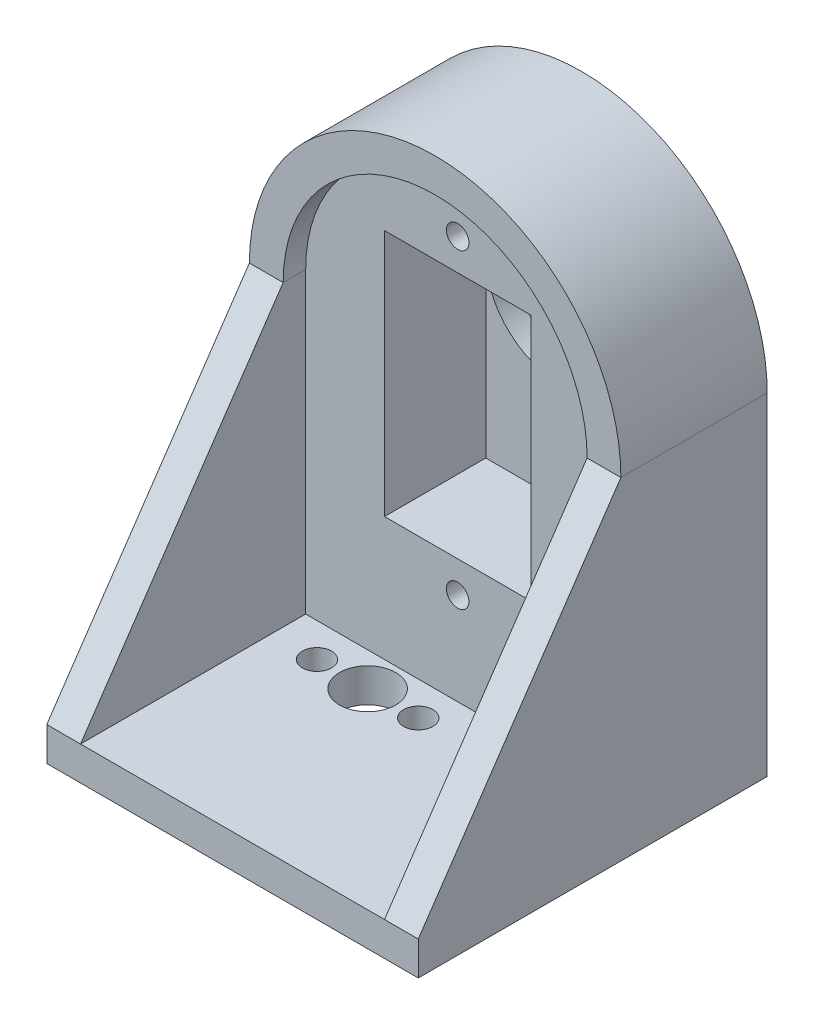
ISO-10303-21;
HEADER;
FILE_DESCRIPTION(('STEP AP214'),'2;1');
FILE_NAME('part.step','',(''),(''),'','','');
FILE_SCHEMA(('AUTOMOTIVE_DESIGN { 1 0 10303 214 1 1 1 1 }'));
ENDSEC;
DATA;
#1=APPLICATION_CONTEXT('core data for automotive mechanical design processes');
#2=APPLICATION_PROTOCOL_DEFINITION('international standard','automotive_design',2000,#1);
#3=PRODUCT_CONTEXT('',#1,'mechanical');
#4=PRODUCT('Part','Part','',(#3));
#5=PRODUCT_RELATED_PRODUCT_CATEGORY('part','',(#4));
#6=PRODUCT_DEFINITION_FORMATION('','',#4);
#7=PRODUCT_DEFINITION_CONTEXT('part definition',#1,'design');
#8=PRODUCT_DEFINITION('design','',#6,#7);
#9=PRODUCT_DEFINITION_SHAPE('','',#8);
#10=(LENGTH_UNIT() NAMED_UNIT(*) SI_UNIT(.MILLI.,.METRE.));
#11=(NAMED_UNIT(*) PLANE_ANGLE_UNIT() SI_UNIT($,.RADIAN.));
#12=(NAMED_UNIT(*) SI_UNIT($,.STERADIAN.) SOLID_ANGLE_UNIT());
#13=UNCERTAINTY_MEASURE_WITH_UNIT(LENGTH_MEASURE(1.E-05),#10,'distance_accuracy_value','');
#14=(GEOMETRIC_REPRESENTATION_CONTEXT(3) GLOBAL_UNCERTAINTY_ASSIGNED_CONTEXT((#13)) GLOBAL_UNIT_ASSIGNED_CONTEXT((#10,
#11,#12)) REPRESENTATION_CONTEXT('',''));
#15=CARTESIAN_POINT('',(0.,0.,0.));
#16=DIRECTION('',(0.,0.,1.));
#17=DIRECTION('',(1.,0.,0.));
#18=AXIS2_PLACEMENT_3D('',#15,#16,#17);
#19=CARTESIAN_POINT('',(0.,0.,13.));
#20=DIRECTION('',(0.,0.,1.));
#21=DIRECTION('',(1.,0.,0.));
#22=AXIS2_PLACEMENT_3D('',#19,#20,#21);
#23=PLANE('',#22);
#24=CARTESIAN_POINT('',(0.,0.,13.));
#25=DIRECTION('',(0.,0.,1.));
#26=DIRECTION('',(1.,0.,0.));
#27=AXIS2_PLACEMENT_3D('',#24,#25,#26);
#28=CIRCLE('',#27,13.5);
#29=CARTESIAN_POINT('',(13.5,0.,13.));
#30=VERTEX_POINT('',#29);
#31=CARTESIAN_POINT('',(-13.5,0.,13.));
#32=VERTEX_POINT('',#31);
#33=EDGE_CURVE('E167',#30,#32,#28,.T.);
#34=ORIENTED_EDGE('',*,*,#33,.F.);
#35=DIRECTION('',(-1.,0.,0.));
#36=VECTOR('',#35,1.);
#37=CARTESIAN_POINT('',(16.5,0.,13.));
#38=LINE('',#37,#36);
#39=CARTESIAN_POINT('',(16.5,0.,13.));
#40=VERTEX_POINT('',#39);
#41=EDGE_CURVE('E149',#40,#30,#38,.T.);
#42=ORIENTED_EDGE('',*,*,#41,.F.);
#43=CARTESIAN_POINT('',(0.,0.,13.));
#44=DIRECTION('',(0.,0.,1.));
#45=DIRECTION('',(1.,0.,0.));
#46=AXIS2_PLACEMENT_3D('',#43,#44,#45);
#47=CIRCLE('',#46,16.5);
#48=CARTESIAN_POINT('',(-16.5,0.,13.));
#49=VERTEX_POINT('',#48);
#50=EDGE_CURVE('E164',#40,#49,#47,.T.);
#51=ORIENTED_EDGE('',*,*,#50,.T.);
#52=DIRECTION('',(-1.,0.,0.));
#53=VECTOR('',#52,1.);
#54=CARTESIAN_POINT('',(-13.5,0.,13.));
#55=LINE('',#54,#53);
#56=EDGE_CURVE('E291',#32,#49,#55,.T.);
#57=ORIENTED_EDGE('',*,*,#56,.F.);
#58=EDGE_LOOP('',(#34,#42,#51,#57));
#59=FACE_BOUND('',#58,.T.);
#60=ADVANCED_FACE('F40',(#59),#23,.T.);
#61=CARTESIAN_POINT('',(-13.5,-26.5,11.));
#62=DIRECTION('',(0.,-1.,0.));
#63=DIRECTION('',(0.,0.,-1.));
#64=AXIS2_PLACEMENT_3D('',#61,#62,#63);
#65=PLANE('',#64);
#66=CARTESIAN_POINT('',(-9.50000000000001,-26.5,14.));
#67=DIRECTION('',(0.,-1.,0.));
#68=DIRECTION('',(0.,0.,-1.));
#69=AXIS2_PLACEMENT_3D('',#66,#67,#68);
#70=CIRCLE('',#69,1.3);
#71=CARTESIAN_POINT('',(-9.50000000000001,-26.5,12.7));
#72=VERTEX_POINT('',#71);
#73=EDGE_CURVE('E280',#72,#72,#70,.T.);
#74=ORIENTED_EDGE('',*,*,#73,.T.);
#75=EDGE_LOOP('',(#74));
#76=FACE_BOUND('',#75,.T.);
#77=CARTESIAN_POINT('',(-0.500000000000004,-26.5,14.));
#78=DIRECTION('',(0.,-1.,0.));
#79=DIRECTION('',(0.,0.,-1.));
#80=AXIS2_PLACEMENT_3D('',#77,#78,#79);
#81=CIRCLE('',#80,1.3);
#82=CARTESIAN_POINT('',(-0.500000000000004,-26.5,12.7));
#83=VERTEX_POINT('',#82);
#84=EDGE_CURVE('E283',#83,#83,#81,.T.);
#85=ORIENTED_EDGE('',*,*,#84,.T.);
#86=EDGE_LOOP('',(#85));
#87=FACE_BOUND('',#86,.T.);
#88=CARTESIAN_POINT('',(-5.,-26.5,14.));
#89=DIRECTION('',(0.,-1.,0.));
#90=DIRECTION('',(0.,0.,-1.));
#91=AXIS2_PLACEMENT_3D('',#88,#89,#90);
#92=CIRCLE('',#91,2.5);
#93=CARTESIAN_POINT('',(-5.,-26.5,11.5));
#94=VERTEX_POINT('',#93);
#95=EDGE_CURVE('E693',#94,#94,#92,.T.);
#96=ORIENTED_EDGE('',*,*,#95,.T.);
#97=EDGE_LOOP('',(#96));
#98=FACE_BOUND('',#97,.T.);
#99=DIRECTION('',(-1.,0.,0.));
#100=VECTOR('',#99,1.);
#101=CARTESIAN_POINT('',(0.,-26.5,31.));
#102=LINE('',#101,#100);
#103=CARTESIAN_POINT('',(13.5,-26.5,31.));
#104=VERTEX_POINT('',#103);
#105=CARTESIAN_POINT('',(-13.5,-26.5,31.));
#106=VERTEX_POINT('',#105);
#107=EDGE_CURVE('E296',#104,#106,#102,.T.);
#108=ORIENTED_EDGE('',*,*,#107,.F.);
#109=DIRECTION('',(0.,0.,1.));
#110=VECTOR('',#109,1.);
#111=CARTESIAN_POINT('',(13.5,-26.5,11.));
#112=LINE('',#111,#110);
#113=CARTESIAN_POINT('',(13.5,-26.5,11.));
#114=VERTEX_POINT('',#113);
#115=EDGE_CURVE('E56',#114,#104,#112,.T.);
#116=ORIENTED_EDGE('',*,*,#115,.F.);
#117=DIRECTION('',(1.,0.,0.));
#118=VECTOR('',#117,1.);
#119=CARTESIAN_POINT('',(-13.5,-26.5,11.));
#120=LINE('',#119,#118);
#121=CARTESIAN_POINT('',(-13.5,-26.5,11.));
#122=VERTEX_POINT('',#121);
#123=EDGE_CURVE('E255',#122,#114,#120,.T.);
#124=ORIENTED_EDGE('',*,*,#123,.F.);
#125=DIRECTION('',(0.,0.,1.));
#126=VECTOR('',#125,1.);
#127=CARTESIAN_POINT('',(-13.5,-26.5,11.));
#128=LINE('',#127,#126);
#129=EDGE_CURVE('E266',#122,#106,#128,.T.);
#130=ORIENTED_EDGE('',*,*,#129,.T.);
#131=EDGE_LOOP('',(#108,#116,#124,#130));
#132=FACE_BOUND('',#131,.T.);
#133=ADVANCED_FACE('F341',(#76,#87,#98,#132),#65,.F.);
#134=CARTESIAN_POINT('',(0.,0.,13.));
#135=DIRECTION('',(0.,0.,-1.));
#136=DIRECTION('',(-1.,0.,0.));
#137=AXIS2_PLACEMENT_3D('',#134,#135,#136);
#138=CYLINDRICAL_SURFACE('',#137,6.5);
#139=CARTESIAN_POINT('',(0.,0.,0.));
#140=DIRECTION('',(0.,0.,1.));
#141=DIRECTION('',(1.,0.,0.));
#142=AXIS2_PLACEMENT_3D('',#139,#140,#141);
#143=CIRCLE('',#142,6.5);
#144=CARTESIAN_POINT('',(6.5,0.,0.));
#145=VERTEX_POINT('',#144);
#146=EDGE_CURVE('E188',#145,#145,#143,.T.);
#147=ORIENTED_EDGE('',*,*,#146,.F.);
#148=EDGE_LOOP('',(#147));
#149=FACE_BOUND('',#148,.T.);
#150=CARTESIAN_POINT('',(0.,0.,2.));
#151=DIRECTION('',(0.,0.,1.));
#152=DIRECTION('',(1.,0.,0.));
#153=AXIS2_PLACEMENT_3D('',#150,#151,#152);
#154=CIRCLE('',#153,6.5);
#155=CARTESIAN_POINT('',(-6.5,0.,2.));
#156=VERTEX_POINT('',#155);
#157=CARTESIAN_POINT('',(6.5,0.,2.));
#158=VERTEX_POINT('',#157);
#159=EDGE_CURVE('E44',#156,#158,#154,.T.);
#160=ORIENTED_EDGE('',*,*,#159,.T.);
#161=CARTESIAN_POINT('',(0.,6.5,2.));
#162=VERTEX_POINT('',#161);
#163=EDGE_CURVE('E11',#158,#162,#154,.T.);
#164=ORIENTED_EDGE('',*,*,#163,.T.);
#165=EDGE_CURVE('E49',#162,#156,#154,.T.);
#166=ORIENTED_EDGE('',*,*,#165,.T.);
#167=EDGE_LOOP('',(#160,#164,#166));
#168=FACE_BOUND('',#167,.T.);
#169=ADVANCED_FACE('F214',(#149,#168),#138,.F.);
#170=CARTESIAN_POINT('',(0.,0.,0.));
#171=DIRECTION('',(0.,0.,1.));
#172=DIRECTION('',(1.,0.,0.));
#173=AXIS2_PLACEMENT_3D('',#170,#171,#172);
#174=PLANE('',#173);
#175=CARTESIAN_POINT('',(0.,0.,0.));
#176=DIRECTION('',(0.,0.,1.));
#177=DIRECTION('',(1.,0.,0.));
#178=AXIS2_PLACEMENT_3D('',#175,#176,#177);
#179=CIRCLE('',#178,16.5);
#180=CARTESIAN_POINT('',(16.5,0.,0.));
#181=VERTEX_POINT('',#180);
#182=CARTESIAN_POINT('',(-16.5,0.,0.));
#183=VERTEX_POINT('',#182);
#184=EDGE_CURVE('E190',#181,#183,#179,.T.);
#185=ORIENTED_EDGE('',*,*,#184,.F.);
#186=DIRECTION('',(0.,1.,0.));
#187=VECTOR('',#186,1.);
#188=CARTESIAN_POINT('',(16.5,-29.5,0.));
#189=LINE('',#188,#187);
#190=CARTESIAN_POINT('',(16.5,-29.5,0.));
#191=VERTEX_POINT('',#190);
#192=EDGE_CURVE('E175',#191,#181,#189,.T.);
#193=ORIENTED_EDGE('',*,*,#192,.F.);
#194=DIRECTION('',(1.,0.,0.));
#195=VECTOR('',#194,1.);
#196=CARTESIAN_POINT('',(-16.5,-29.5,0.));
#197=LINE('',#196,#195);
#198=CARTESIAN_POINT('',(-16.5,-29.5,0.));
#199=VERTEX_POINT('',#198);
#200=EDGE_CURVE('E184',#199,#191,#197,.T.);
#201=ORIENTED_EDGE('',*,*,#200,.F.);
#202=DIRECTION('',(0.,-1.,0.));
#203=VECTOR('',#202,1.);
#204=CARTESIAN_POINT('',(-16.5,0.,0.));
#205=LINE('',#204,#203);
#206=EDGE_CURVE('E192',#183,#199,#205,.T.);
#207=ORIENTED_EDGE('',*,*,#206,.F.);
#208=EDGE_LOOP('',(#185,#193,#201,#207));
#209=FACE_BOUND('',#208,.T.);
#210=ORIENTED_EDGE('',*,*,#146,.T.);
#211=EDGE_LOOP('',(#210));
#212=FACE_BOUND('',#211,.T.);
#213=ADVANCED_FACE('F351',(#209,#212),#174,.F.);
#214=CARTESIAN_POINT('',(0.,0.,13.));
#215=DIRECTION('',(0.,0.,-1.));
#216=DIRECTION('',(-1.,0.,0.));
#217=AXIS2_PLACEMENT_3D('',#214,#215,#216);
#218=CYLINDRICAL_SURFACE('',#217,16.5);
#219=ORIENTED_EDGE('',*,*,#184,.T.);
#220=DIRECTION('',(0.,0.,-1.));
#221=VECTOR('',#220,1.);
#222=CARTESIAN_POINT('',(-16.5,0.,13.));
#223=LINE('',#222,#221);
#224=EDGE_CURVE('E182',#49,#183,#223,.T.);
#225=ORIENTED_EDGE('',*,*,#224,.F.);
#226=ORIENTED_EDGE('',*,*,#50,.F.);
#227=DIRECTION('',(0.,0.,-1.));
#228=VECTOR('',#227,1.);
#229=CARTESIAN_POINT('',(16.5,0.,13.));
#230=LINE('',#229,#228);
#231=EDGE_CURVE('E171',#40,#181,#230,.T.);
#232=ORIENTED_EDGE('',*,*,#231,.T.);
#233=EDGE_LOOP('',(#219,#225,#226,#232));
#234=FACE_BOUND('',#233,.T.);
#235=ADVANCED_FACE('F42',(#234),#218,.T.);
#236=CARTESIAN_POINT('',(-16.5,0.,13.));
#237=DIRECTION('',(1.,0.,0.));
#238=DIRECTION('',(0.,0.,-1.));
#239=AXIS2_PLACEMENT_3D('',#236,#237,#238);
#240=PLANE('',#239);
#241=ORIENTED_EDGE('',*,*,#206,.T.);
#242=DIRECTION('',(0.,0.,-1.));
#243=VECTOR('',#242,1.);
#244=CARTESIAN_POINT('',(-16.5,-29.5,13.));
#245=LINE('',#244,#243);
#246=CARTESIAN_POINT('',(-16.5,-29.5,31.));
#247=VERTEX_POINT('',#246);
#248=EDGE_CURVE('E196',#247,#199,#245,.T.);
#249=ORIENTED_EDGE('',*,*,#248,.F.);
#250=DIRECTION('',(0.,-1.,0.));
#251=VECTOR('',#250,1.);
#252=CARTESIAN_POINT('',(-16.5,0.,31.));
#253=LINE('',#252,#251);
#254=CARTESIAN_POINT('',(-16.5,-26.5,31.));
#255=VERTEX_POINT('',#254);
#256=EDGE_CURVE('E298',#255,#247,#253,.T.);
#257=ORIENTED_EDGE('',*,*,#256,.F.);
#258=DIRECTION('',(0.,-0.827216691275022,0.561883035583034));
#259=VECTOR('',#258,1.);
#260=CARTESIAN_POINT('',(-16.5,0.,13.));
#261=LINE('',#260,#259);
#262=EDGE_CURVE('E168',#49,#255,#261,.T.);
#263=ORIENTED_EDGE('',*,*,#262,.F.);
#264=ORIENTED_EDGE('',*,*,#224,.T.);
#265=EDGE_LOOP('',(#241,#249,#257,#263,#264));
#266=FACE_BOUND('',#265,.T.);
#267=ADVANCED_FACE('F359',(#266),#240,.F.);
#268=CARTESIAN_POINT('',(-16.5,-29.5,13.));
#269=DIRECTION('',(0.,1.,0.));
#270=DIRECTION('',(0.,0.,1.));
#271=AXIS2_PLACEMENT_3D('',#268,#269,#270);
#272=PLANE('',#271);
#273=CARTESIAN_POINT('',(-9.50000000000001,-29.5,14.));
#274=DIRECTION('',(0.,-1.,0.));
#275=DIRECTION('',(0.,0.,-1.));
#276=AXIS2_PLACEMENT_3D('',#273,#274,#275);
#277=CIRCLE('',#276,1.3);
#278=CARTESIAN_POINT('',(-9.50000000000001,-29.5,12.7));
#279=VERTEX_POINT('',#278);
#280=EDGE_CURVE('E685',#279,#279,#277,.T.);
#281=ORIENTED_EDGE('',*,*,#280,.F.);
#282=EDGE_LOOP('',(#281));
#283=FACE_BOUND('',#282,.T.);
#284=CARTESIAN_POINT('',(-0.500000000000004,-29.5,14.));
#285=DIRECTION('',(0.,-1.,0.));
#286=DIRECTION('',(0.,0.,-1.));
#287=AXIS2_PLACEMENT_3D('',#284,#285,#286);
#288=CIRCLE('',#287,1.3);
#289=CARTESIAN_POINT('',(-0.500000000000004,-29.5,12.7));
#290=VERTEX_POINT('',#289);
#291=EDGE_CURVE('E699',#290,#290,#288,.T.);
#292=ORIENTED_EDGE('',*,*,#291,.F.);
#293=EDGE_LOOP('',(#292));
#294=FACE_BOUND('',#293,.T.);
#295=CARTESIAN_POINT('',(-5.,-29.5,14.));
#296=DIRECTION('',(0.,-1.,0.));
#297=DIRECTION('',(0.,0.,-1.));
#298=AXIS2_PLACEMENT_3D('',#295,#296,#297);
#299=CIRCLE('',#298,2.5);
#300=CARTESIAN_POINT('',(-5.,-29.5,11.5));
#301=VERTEX_POINT('',#300);
#302=EDGE_CURVE('E695',#301,#301,#299,.T.);
#303=ORIENTED_EDGE('',*,*,#302,.F.);
#304=EDGE_LOOP('',(#303));
#305=FACE_BOUND('',#304,.T.);
#306=ORIENTED_EDGE('',*,*,#200,.T.);
#307=DIRECTION('',(0.,0.,-1.));
#308=VECTOR('',#307,1.);
#309=CARTESIAN_POINT('',(16.5,-29.5,13.));
#310=LINE('',#309,#308);
#311=CARTESIAN_POINT('',(16.5,-29.5,31.));
#312=VERTEX_POINT('',#311);
#313=EDGE_CURVE('E179',#312,#191,#310,.T.);
#314=ORIENTED_EDGE('',*,*,#313,.F.);
#315=DIRECTION('',(1.,0.,0.));
#316=VECTOR('',#315,1.);
#317=CARTESIAN_POINT('',(0.,-29.5,31.));
#318=LINE('',#317,#316);
#319=EDGE_CURVE('E301',#247,#312,#318,.T.);
#320=ORIENTED_EDGE('',*,*,#319,.F.);
#321=ORIENTED_EDGE('',*,*,#248,.T.);
#322=EDGE_LOOP('',(#306,#314,#320,#321));
#323=FACE_BOUND('',#322,.T.);
#324=ADVANCED_FACE('F357',(#283,#294,#305,#323),#272,.F.);
#325=CARTESIAN_POINT('',(16.5,-29.5,13.));
#326=DIRECTION('',(-1.,0.,0.));
#327=DIRECTION('',(0.,0.,1.));
#328=AXIS2_PLACEMENT_3D('',#325,#326,#327);
#329=PLANE('',#328);
#330=ORIENTED_EDGE('',*,*,#231,.F.);
#331=DIRECTION('',(0.,-0.827216691275022,0.561883035583034));
#332=VECTOR('',#331,1.);
#333=CARTESIAN_POINT('',(16.5,0.,13.));
#334=LINE('',#333,#332);
#335=CARTESIAN_POINT('',(16.5,-26.5,31.));
#336=VERTEX_POINT('',#335);
#337=EDGE_CURVE('E146',#40,#336,#334,.T.);
#338=ORIENTED_EDGE('',*,*,#337,.T.);
#339=DIRECTION('',(0.,1.,0.));
#340=VECTOR('',#339,1.);
#341=CARTESIAN_POINT('',(16.5,0.,31.));
#342=LINE('',#341,#340);
#343=EDGE_CURVE('E294',#312,#336,#342,.T.);
#344=ORIENTED_EDGE('',*,*,#343,.F.);
#345=ORIENTED_EDGE('',*,*,#313,.T.);
#346=ORIENTED_EDGE('',*,*,#192,.T.);
#347=EDGE_LOOP('',(#330,#338,#344,#345,#346));
#348=FACE_BOUND('',#347,.T.);
#349=ADVANCED_FACE('F172',(#348),#329,.F.);
#350=CARTESIAN_POINT('',(0.,0.,11.));
#351=DIRECTION('',(0.,0.,1.));
#352=DIRECTION('',(1.,0.,0.));
#353=AXIS2_PLACEMENT_3D('',#350,#351,#352);
#354=CYLINDRICAL_SURFACE('',#353,13.5);
#355=ORIENTED_EDGE('',*,*,#33,.T.);
#356=DIRECTION('',(0.,0.,1.));
#357=VECTOR('',#356,1.);
#358=CARTESIAN_POINT('',(-13.5,0.,11.));
#359=LINE('',#358,#357);
#360=CARTESIAN_POINT('',(-13.5,0.,11.));
#361=VERTEX_POINT('',#360);
#362=EDGE_CURVE('E261',#361,#32,#359,.T.);
#363=ORIENTED_EDGE('',*,*,#362,.F.);
#364=CARTESIAN_POINT('',(0.,0.,11.));
#365=DIRECTION('',(0.,0.,1.));
#366=DIRECTION('',(1.,0.,0.));
#367=AXIS2_PLACEMENT_3D('',#364,#365,#366);
#368=CIRCLE('',#367,13.5);
#369=CARTESIAN_POINT('',(13.5,0.,11.));
#370=VERTEX_POINT('',#369);
#371=EDGE_CURVE('E249',#370,#361,#368,.T.);
#372=ORIENTED_EDGE('',*,*,#371,.F.);
#373=DIRECTION('',(0.,0.,1.));
#374=VECTOR('',#373,1.);
#375=CARTESIAN_POINT('',(13.5,0.,11.));
#376=LINE('',#375,#374);
#377=EDGE_CURVE('E263',#370,#30,#376,.T.);
#378=ORIENTED_EDGE('',*,*,#377,.T.);
#379=EDGE_LOOP('',(#355,#363,#372,#378));
#380=FACE_BOUND('',#379,.T.);
#381=ADVANCED_FACE('F277',(#380),#354,.F.);
#382=CARTESIAN_POINT('',(13.5,-26.5,11.));
#383=DIRECTION('',(1.,0.,0.));
#384=DIRECTION('',(0.,0.,-1.));
#385=AXIS2_PLACEMENT_3D('',#382,#383,#384);
#386=PLANE('',#385);
#387=ORIENTED_EDGE('',*,*,#115,.T.);
#388=DIRECTION('',(0.,-0.827216691275022,0.561883035583034));
#389=VECTOR('',#388,1.);
#390=CARTESIAN_POINT('',(13.5,0.,13.));
#391=LINE('',#390,#389);
#392=EDGE_CURVE('E157',#30,#104,#391,.T.);
#393=ORIENTED_EDGE('',*,*,#392,.F.);
#394=ORIENTED_EDGE('',*,*,#377,.F.);
#395=DIRECTION('',(0.,1.,0.));
#396=VECTOR('',#395,1.);
#397=CARTESIAN_POINT('',(13.5,-26.5,11.));
#398=LINE('',#397,#396);
#399=EDGE_CURVE('E258',#114,#370,#398,.T.);
#400=ORIENTED_EDGE('',*,*,#399,.F.);
#401=EDGE_LOOP('',(#387,#393,#394,#400));
#402=FACE_BOUND('',#401,.T.);
#403=ADVANCED_FACE('F278',(#402),#386,.F.);
#404=CARTESIAN_POINT('',(-13.5,0.,11.));
#405=DIRECTION('',(-1.,0.,0.));
#406=DIRECTION('',(0.,0.,1.));
#407=AXIS2_PLACEMENT_3D('',#404,#405,#406);
#408=PLANE('',#407);
#409=ORIENTED_EDGE('',*,*,#362,.T.);
#410=DIRECTION('',(0.,-0.827216691275022,0.561883035583034));
#411=VECTOR('',#410,1.);
#412=CARTESIAN_POINT('',(-13.5,0.,13.));
#413=LINE('',#412,#411);
#414=EDGE_CURVE('E273',#32,#106,#413,.T.);
#415=ORIENTED_EDGE('',*,*,#414,.T.);
#416=ORIENTED_EDGE('',*,*,#129,.F.);
#417=DIRECTION('',(0.,-1.,0.));
#418=VECTOR('',#417,1.);
#419=CARTESIAN_POINT('',(-13.5,0.,11.));
#420=LINE('',#419,#418);
#421=EDGE_CURVE('E252',#361,#122,#420,.T.);
#422=ORIENTED_EDGE('',*,*,#421,.F.);
#423=EDGE_LOOP('',(#409,#415,#416,#422));
#424=FACE_BOUND('',#423,.T.);
#425=ADVANCED_FACE('F272',(#424),#408,.F.);
#426=CARTESIAN_POINT('',(0.,0.,11.));
#427=DIRECTION('',(0.,0.,1.));
#428=DIRECTION('',(1.,0.,0.));
#429=AXIS2_PLACEMENT_3D('',#426,#427,#428);
#430=PLANE('',#429);
#431=CARTESIAN_POINT('',(0.,-18.3,11.));
#432=DIRECTION('',(0.,0.,1.));
#433=DIRECTION('',(-1.,0.,0.));
#434=AXIS2_PLACEMENT_3D('',#431,#432,#433);
#435=CIRCLE('',#434,1.);
#436=CARTESIAN_POINT('',(-1.,-18.3,11.));
#437=VERTEX_POINT('',#436);
#438=EDGE_CURVE('E304',#437,#437,#435,.T.);
#439=ORIENTED_EDGE('',*,*,#438,.F.);
#440=EDGE_LOOP('',(#439));
#441=FACE_BOUND('',#440,.T.);
#442=CARTESIAN_POINT('',(0.,9.3,11.));
#443=DIRECTION('',(0.,0.,1.));
#444=DIRECTION('',(1.,0.,0.));
#445=AXIS2_PLACEMENT_3D('',#442,#443,#444);
#446=CIRCLE('',#445,1.);
#447=CARTESIAN_POINT('',(1.,9.3,11.));
#448=VERTEX_POINT('',#447);
#449=EDGE_CURVE('E307',#448,#448,#446,.T.);
#450=ORIENTED_EDGE('',*,*,#449,.F.);
#451=EDGE_LOOP('',(#450));
#452=FACE_BOUND('',#451,.T.);
#453=DIRECTION('',(-1.,0.,0.));
#454=VECTOR('',#453,1.);
#455=CARTESIAN_POINT('',(0.,6.5,11.));
#456=LINE('',#455,#454);
#457=CARTESIAN_POINT('',(6.5,6.5,11.));
#458=VERTEX_POINT('',#457);
#459=CARTESIAN_POINT('',(-6.5,6.5,11.));
#460=VERTEX_POINT('',#459);
#461=EDGE_CURVE('E204',#458,#460,#456,.T.);
#462=ORIENTED_EDGE('',*,*,#461,.F.);
#463=DIRECTION('',(0.,1.,0.));
#464=VECTOR('',#463,1.);
#465=CARTESIAN_POINT('',(6.5,0.,11.));
#466=LINE('',#465,#464);
#467=CARTESIAN_POINT('',(6.5,-15.5,11.));
#468=VERTEX_POINT('',#467);
#469=EDGE_CURVE('E201',#468,#458,#466,.T.);
#470=ORIENTED_EDGE('',*,*,#469,.F.);
#471=DIRECTION('',(1.,0.,0.));
#472=VECTOR('',#471,1.);
#473=CARTESIAN_POINT('',(-6.5,-15.5,11.));
#474=LINE('',#473,#472);
#475=CARTESIAN_POINT('',(-6.5,-15.5,11.));
#476=VERTEX_POINT('',#475);
#477=EDGE_CURVE('E239',#476,#468,#474,.T.);
#478=ORIENTED_EDGE('',*,*,#477,.F.);
#479=DIRECTION('',(0.,-1.,0.));
#480=VECTOR('',#479,1.);
#481=CARTESIAN_POINT('',(-6.5,0.,11.));
#482=LINE('',#481,#480);
#483=EDGE_CURVE('E200',#460,#476,#482,.T.);
#484=ORIENTED_EDGE('',*,*,#483,.F.);
#485=EDGE_LOOP('',(#462,#470,#478,#484));
#486=FACE_BOUND('',#485,.T.);
#487=ORIENTED_EDGE('',*,*,#371,.T.);
#488=ORIENTED_EDGE('',*,*,#421,.T.);
#489=ORIENTED_EDGE('',*,*,#123,.T.);
#490=ORIENTED_EDGE('',*,*,#399,.T.);
#491=EDGE_LOOP('',(#487,#488,#489,#490));
#492=FACE_BOUND('',#491,.T.);
#493=ADVANCED_FACE('F326',(#441,#452,#486,#492),#430,.T.);
#494=CARTESIAN_POINT('',(0.,0.,2.));
#495=DIRECTION('',(0.,0.,1.));
#496=DIRECTION('',(1.,0.,0.));
#497=AXIS2_PLACEMENT_3D('',#494,#495,#496);
#498=PLANE('',#497);
#499=DIRECTION('',(0.,1.,0.));
#500=VECTOR('',#499,1.);
#501=CARTESIAN_POINT('',(6.5,6.5,2.));
#502=LINE('',#501,#500);
#503=CARTESIAN_POINT('',(6.5,6.5,2.));
#504=VERTEX_POINT('',#503);
#505=EDGE_CURVE('E231',#158,#504,#502,.T.);
#506=ORIENTED_EDGE('',*,*,#505,.T.);
#507=DIRECTION('',(-1.,0.,0.));
#508=VECTOR('',#507,1.);
#509=CARTESIAN_POINT('',(-6.5,6.5,2.));
#510=LINE('',#509,#508);
#511=EDGE_CURVE('E226',#504,#162,#510,.T.);
#512=ORIENTED_EDGE('',*,*,#511,.T.);
#513=ORIENTED_EDGE('',*,*,#163,.F.);
#514=EDGE_LOOP('',(#506,#512,#513));
#515=FACE_BOUND('',#514,.T.);
#516=ADVANCED_FACE('F230',(#515),#498,.T.);
#517=CARTESIAN_POINT('',(-6.5,6.5,2.));
#518=VERTEX_POINT('',#517);
#519=EDGE_CURVE('E220',#162,#518,#510,.T.);
#520=ORIENTED_EDGE('',*,*,#519,.T.);
#521=DIRECTION('',(0.,-1.,0.));
#522=VECTOR('',#521,1.);
#523=CARTESIAN_POINT('',(-6.5,6.5,2.));
#524=LINE('',#523,#522);
#525=EDGE_CURVE('E222',#518,#156,#524,.T.);
#526=ORIENTED_EDGE('',*,*,#525,.T.);
#527=ORIENTED_EDGE('',*,*,#165,.F.);
#528=EDGE_LOOP('',(#520,#526,#527));
#529=FACE_BOUND('',#528,.T.);
#530=ADVANCED_FACE('F219',(#529),#498,.T.);
#531=CARTESIAN_POINT('',(-6.5,6.5,2.));
#532=DIRECTION('',(-1.,0.,0.));
#533=DIRECTION('',(0.,-1.,0.));
#534=AXIS2_PLACEMENT_3D('',#531,#532,#533);
#535=PLANE('',#534);
#536=ORIENTED_EDGE('',*,*,#483,.T.);
#537=DIRECTION('',(0.,0.,1.));
#538=VECTOR('',#537,1.);
#539=CARTESIAN_POINT('',(-6.5,-15.5,2.));
#540=LINE('',#539,#538);
#541=CARTESIAN_POINT('',(-6.5,-15.5,2.));
#542=VERTEX_POINT('',#541);
#543=EDGE_CURVE('E233',#542,#476,#540,.T.);
#544=ORIENTED_EDGE('',*,*,#543,.F.);
#545=EDGE_CURVE('E242',#156,#542,#524,.T.);
#546=ORIENTED_EDGE('',*,*,#545,.F.);
#547=ORIENTED_EDGE('',*,*,#525,.F.);
#548=DIRECTION('',(0.,0.,1.));
#549=VECTOR('',#548,1.);
#550=CARTESIAN_POINT('',(-6.5,6.5,2.));
#551=LINE('',#550,#549);
#552=EDGE_CURVE('E227',#518,#460,#551,.T.);
#553=ORIENTED_EDGE('',*,*,#552,.T.);
#554=EDGE_LOOP('',(#536,#544,#546,#547,#553));
#555=FACE_BOUND('',#554,.T.);
#556=ADVANCED_FACE('F329',(#555),#535,.F.);
#557=CARTESIAN_POINT('',(-6.5,6.5,2.));
#558=DIRECTION('',(0.,1.,0.));
#559=DIRECTION('',(0.,0.,1.));
#560=AXIS2_PLACEMENT_3D('',#557,#558,#559);
#561=PLANE('',#560);
#562=ORIENTED_EDGE('',*,*,#461,.T.);
#563=ORIENTED_EDGE('',*,*,#552,.F.);
#564=ORIENTED_EDGE('',*,*,#519,.F.);
#565=ORIENTED_EDGE('',*,*,#511,.F.);
#566=DIRECTION('',(0.,0.,1.));
#567=VECTOR('',#566,1.);
#568=CARTESIAN_POINT('',(6.5,6.5,2.));
#569=LINE('',#568,#567);
#570=EDGE_CURVE('E245',#504,#458,#569,.T.);
#571=ORIENTED_EDGE('',*,*,#570,.T.);
#572=EDGE_LOOP('',(#562,#563,#564,#565,#571));
#573=FACE_BOUND('',#572,.T.);
#574=ADVANCED_FACE('F225',(#573),#561,.F.);
#575=CARTESIAN_POINT('',(6.5,6.5,2.));
#576=DIRECTION('',(1.,0.,0.));
#577=DIRECTION('',(0.,1.,0.));
#578=AXIS2_PLACEMENT_3D('',#575,#576,#577);
#579=PLANE('',#578);
#580=ORIENTED_EDGE('',*,*,#469,.T.);
#581=ORIENTED_EDGE('',*,*,#570,.F.);
#582=ORIENTED_EDGE('',*,*,#505,.F.);
#583=CARTESIAN_POINT('',(6.5,-15.5,2.));
#584=VERTEX_POINT('',#583);
#585=EDGE_CURVE('E64',#584,#158,#502,.T.);
#586=ORIENTED_EDGE('',*,*,#585,.F.);
#587=DIRECTION('',(0.,0.,1.));
#588=VECTOR('',#587,1.);
#589=CARTESIAN_POINT('',(6.5,-15.5,2.));
#590=LINE('',#589,#588);
#591=EDGE_CURVE('E234',#584,#468,#590,.T.);
#592=ORIENTED_EDGE('',*,*,#591,.T.);
#593=EDGE_LOOP('',(#580,#581,#582,#586,#592));
#594=FACE_BOUND('',#593,.T.);
#595=ADVANCED_FACE('F324',(#594),#579,.F.);
#596=CARTESIAN_POINT('',(-6.5,-15.5,2.));
#597=DIRECTION('',(0.,-1.,0.));
#598=DIRECTION('',(0.,0.,-1.));
#599=AXIS2_PLACEMENT_3D('',#596,#597,#598);
#600=PLANE('',#599);
#601=ORIENTED_EDGE('',*,*,#477,.T.);
#602=ORIENTED_EDGE('',*,*,#591,.F.);
#603=DIRECTION('',(1.,0.,0.));
#604=VECTOR('',#603,1.);
#605=CARTESIAN_POINT('',(-6.5,-15.5,2.));
#606=LINE('',#605,#604);
#607=EDGE_CURVE('E315',#542,#584,#606,.T.);
#608=ORIENTED_EDGE('',*,*,#607,.F.);
#609=ORIENTED_EDGE('',*,*,#543,.T.);
#610=EDGE_LOOP('',(#601,#602,#608,#609));
#611=FACE_BOUND('',#610,.T.);
#612=ADVANCED_FACE('F321',(#611),#600,.F.);
#613=ORIENTED_EDGE('',*,*,#545,.T.);
#614=ORIENTED_EDGE('',*,*,#607,.T.);
#615=ORIENTED_EDGE('',*,*,#585,.T.);
#616=ORIENTED_EDGE('',*,*,#159,.F.);
#617=EDGE_LOOP('',(#613,#614,#615,#616));
#618=FACE_BOUND('',#617,.T.);
#619=ADVANCED_FACE('F317',(#618),#498,.T.);
#620=CARTESIAN_POINT('',(0.,9.3,2.));
#621=DIRECTION('',(0.,0.,1.));
#622=DIRECTION('',(1.,0.,0.));
#623=AXIS2_PLACEMENT_3D('',#620,#621,#622);
#624=CYLINDRICAL_SURFACE('',#623,1.);
#625=CARTESIAN_POINT('',(0.,9.3,2.));
#626=DIRECTION('',(0.,0.,1.));
#627=DIRECTION('',(1.,0.,0.));
#628=AXIS2_PLACEMENT_3D('',#625,#626,#627);
#629=CIRCLE('',#628,1.);
#630=CARTESIAN_POINT('',(1.,9.3,2.));
#631=VERTEX_POINT('',#630);
#632=EDGE_CURVE('E243',#631,#631,#629,.T.);
#633=ORIENTED_EDGE('',*,*,#632,.F.);
#634=EDGE_LOOP('',(#633));
#635=FACE_BOUND('',#634,.T.);
#636=ORIENTED_EDGE('',*,*,#449,.T.);
#637=EDGE_LOOP('',(#636));
#638=FACE_BOUND('',#637,.T.);
#639=ADVANCED_FACE('F559',(#635,#638),#624,.F.);
#640=CARTESIAN_POINT('',(0.,9.3,2.));
#641=DIRECTION('',(0.,0.,1.));
#642=DIRECTION('',(1.,0.,0.));
#643=AXIS2_PLACEMENT_3D('',#640,#641,#642);
#644=PLANE('',#643);
#645=ORIENTED_EDGE('',*,*,#632,.T.);
#646=EDGE_LOOP('',(#645));
#647=FACE_BOUND('',#646,.T.);
#648=ADVANCED_FACE('F548',(#647),#644,.T.);
#649=CARTESIAN_POINT('',(0.,-18.3,2.));
#650=DIRECTION('',(0.,0.,1.));
#651=DIRECTION('',(1.,0.,0.));
#652=AXIS2_PLACEMENT_3D('',#649,#650,#651);
#653=CYLINDRICAL_SURFACE('',#652,1.);
#654=CARTESIAN_POINT('',(0.,-18.3,2.));
#655=DIRECTION('',(0.,0.,1.));
#656=DIRECTION('',(-1.,0.,0.));
#657=AXIS2_PLACEMENT_3D('',#654,#655,#656);
#658=CIRCLE('',#657,1.);
#659=CARTESIAN_POINT('',(-1.,-18.3,2.));
#660=VERTEX_POINT('',#659);
#661=EDGE_CURVE('E310',#660,#660,#658,.T.);
#662=ORIENTED_EDGE('',*,*,#661,.F.);
#663=EDGE_LOOP('',(#662));
#664=FACE_BOUND('',#663,.T.);
#665=ORIENTED_EDGE('',*,*,#438,.T.);
#666=EDGE_LOOP('',(#665));
#667=FACE_BOUND('',#666,.T.);
#668=ADVANCED_FACE('F537',(#664,#667),#653,.F.);
#669=CARTESIAN_POINT('',(0.,-18.3,2.));
#670=DIRECTION('',(0.,0.,-1.));
#671=DIRECTION('',(-1.,0.,0.));
#672=AXIS2_PLACEMENT_3D('',#669,#670,#671);
#673=PLANE('',#672);
#674=ORIENTED_EDGE('',*,*,#661,.T.);
#675=EDGE_LOOP('',(#674));
#676=FACE_BOUND('',#675,.T.);
#677=ADVANCED_FACE('F430',(#676),#673,.F.);
#678=CARTESIAN_POINT('',(0.,0.,31.));
#679=DIRECTION('',(0.,0.,1.));
#680=DIRECTION('',(1.,0.,0.));
#681=AXIS2_PLACEMENT_3D('',#678,#679,#680);
#682=PLANE('',#681);
#683=ORIENTED_EDGE('',*,*,#343,.T.);
#684=EDGE_CURVE('E152',#336,#104,#102,.T.);
#685=ORIENTED_EDGE('',*,*,#684,.T.);
#686=ORIENTED_EDGE('',*,*,#107,.T.);
#687=DIRECTION('',(-1.,0.,0.));
#688=VECTOR('',#687,1.);
#689=CARTESIAN_POINT('',(-13.5,-26.5,31.));
#690=LINE('',#689,#688);
#691=EDGE_CURVE('E287',#106,#255,#690,.T.);
#692=ORIENTED_EDGE('',*,*,#691,.T.);
#693=ORIENTED_EDGE('',*,*,#256,.T.);
#694=ORIENTED_EDGE('',*,*,#319,.T.);
#695=EDGE_LOOP('',(#683,#685,#686,#692,#693,#694));
#696=FACE_BOUND('',#695,.T.);
#697=ADVANCED_FACE('F424',(#696),#682,.T.);
#698=CARTESIAN_POINT('',(-13.5,0.,13.));
#699=DIRECTION('',(0.,-0.561883035583034,-0.827216691275022));
#700=DIRECTION('',(0.,0.827216691275022,-0.561883035583034));
#701=AXIS2_PLACEMENT_3D('',#698,#699,#700);
#702=PLANE('',#701);
#703=ORIENTED_EDGE('',*,*,#262,.T.);
#704=ORIENTED_EDGE('',*,*,#691,.F.);
#705=ORIENTED_EDGE('',*,*,#414,.F.);
#706=ORIENTED_EDGE('',*,*,#56,.T.);
#707=EDGE_LOOP('',(#703,#704,#705,#706));
#708=FACE_BOUND('',#707,.T.);
#709=ADVANCED_FACE('F429',(#708),#702,.F.);
#710=CARTESIAN_POINT('',(16.5,0.,13.));
#711=DIRECTION('',(0.,-0.561883035583034,-0.827216691275022));
#712=DIRECTION('',(0.,0.827216691275022,-0.561883035583034));
#713=AXIS2_PLACEMENT_3D('',#710,#711,#712);
#714=PLANE('',#713);
#715=ORIENTED_EDGE('',*,*,#392,.T.);
#716=ORIENTED_EDGE('',*,*,#684,.F.);
#717=ORIENTED_EDGE('',*,*,#337,.F.);
#718=ORIENTED_EDGE('',*,*,#41,.T.);
#719=EDGE_LOOP('',(#715,#716,#717,#718));
#720=FACE_BOUND('',#719,.T.);
#721=ADVANCED_FACE('F148',(#720),#714,.F.);
#722=CARTESIAN_POINT('',(-5.,-24.5,14.));
#723=DIRECTION('',(0.,-1.,0.));
#724=DIRECTION('',(0.,0.,-1.));
#725=AXIS2_PLACEMENT_3D('',#722,#723,#724);
#726=CYLINDRICAL_SURFACE('',#725,2.5);
#727=ORIENTED_EDGE('',*,*,#302,.T.);
#728=EDGE_LOOP('',(#727));
#729=FACE_BOUND('',#728,.T.);
#730=ORIENTED_EDGE('',*,*,#95,.F.);
#731=EDGE_LOOP('',(#730));
#732=FACE_BOUND('',#731,.T.);
#733=ADVANCED_FACE('F442',(#729,#732),#726,.F.);
#734=CARTESIAN_POINT('',(-0.500000000000004,-24.5,14.));
#735=DIRECTION('',(0.,-1.,0.));
#736=DIRECTION('',(0.,0.,-1.));
#737=AXIS2_PLACEMENT_3D('',#734,#735,#736);
#738=CYLINDRICAL_SURFACE('',#737,1.3);
#739=ORIENTED_EDGE('',*,*,#291,.T.);
#740=EDGE_LOOP('',(#739));
#741=FACE_BOUND('',#740,.T.);
#742=ORIENTED_EDGE('',*,*,#84,.F.);
#743=EDGE_LOOP('',(#742));
#744=FACE_BOUND('',#743,.T.);
#745=ADVANCED_FACE('F466',(#741,#744),#738,.F.);
#746=CARTESIAN_POINT('',(-9.50000000000001,-24.5,14.));
#747=DIRECTION('',(0.,-1.,0.));
#748=DIRECTION('',(0.,0.,-1.));
#749=AXIS2_PLACEMENT_3D('',#746,#747,#748);
#750=CYLINDRICAL_SURFACE('',#749,1.3);
#751=ORIENTED_EDGE('',*,*,#280,.T.);
#752=EDGE_LOOP('',(#751));
#753=FACE_BOUND('',#752,.T.);
#754=ORIENTED_EDGE('',*,*,#73,.F.);
#755=EDGE_LOOP('',(#754));
#756=FACE_BOUND('',#755,.T.);
#757=ADVANCED_FACE('F477',(#753,#756),#750,.F.);
#758=CLOSED_SHELL('',(#60,#133,#169,#213,#235,#267,#324,#349,#381,#403,#425,#493,#516,#530,#556,
#574,#595,#612,#619,#639,#648,#668,#677,#697,#709,#721,#733,#745,#757));
#759=MANIFOLD_SOLID_BREP('B2',#758);
#760=ADVANCED_BREP_SHAPE_REPRESENTATION('',(#18,#759),#14);
#761=SHAPE_DEFINITION_REPRESENTATION(#9,#760);
ENDSEC;
END-ISO-10303-21;
